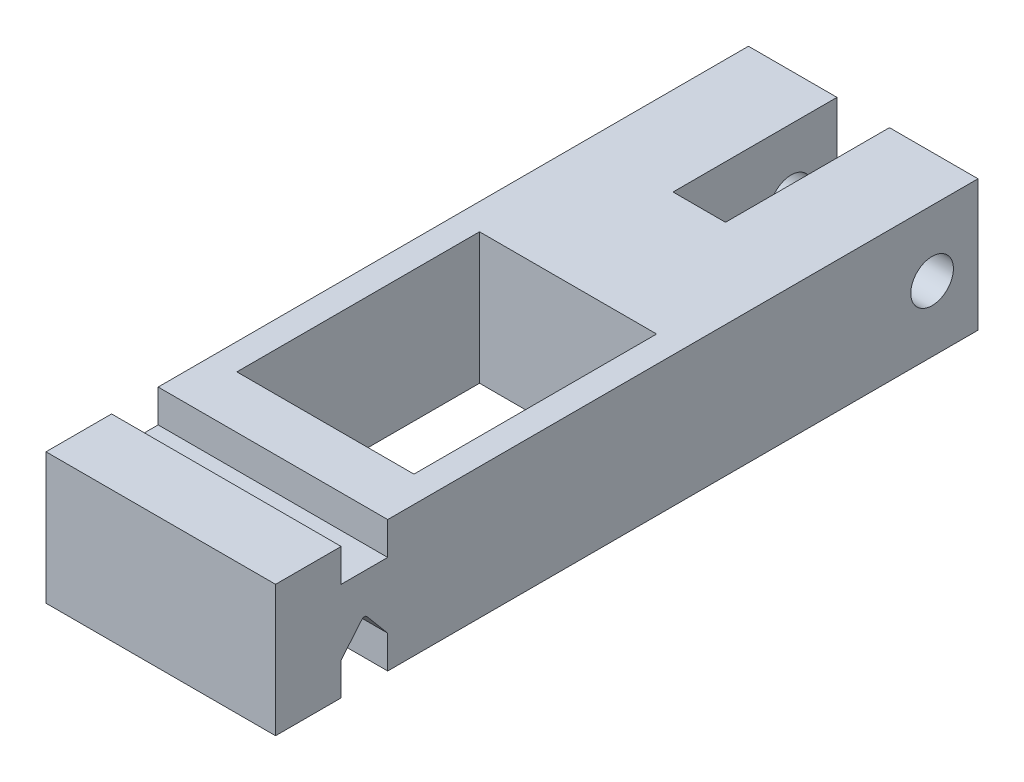
ISO-10303-21;
HEADER;
FILE_DESCRIPTION(('STEP AP214'),'2;1');
FILE_NAME('part.step','',(''),(''),'','','');
FILE_SCHEMA(('AUTOMOTIVE_DESIGN { 1 0 10303 214 1 1 1 1 }'));
ENDSEC;
DATA;
#1=APPLICATION_CONTEXT('core data for automotive mechanical design processes');
#2=APPLICATION_PROTOCOL_DEFINITION('international standard','automotive_design',2000,#1);
#3=PRODUCT_CONTEXT('',#1,'mechanical');
#4=PRODUCT('Part','Part','',(#3));
#5=PRODUCT_RELATED_PRODUCT_CATEGORY('part','',(#4));
#6=PRODUCT_DEFINITION_FORMATION('','',#4);
#7=PRODUCT_DEFINITION_CONTEXT('part definition',#1,'design');
#8=PRODUCT_DEFINITION('design','',#6,#7);
#9=PRODUCT_DEFINITION_SHAPE('','',#8);
#10=(LENGTH_UNIT() NAMED_UNIT(*) SI_UNIT(.MILLI.,.METRE.));
#11=(NAMED_UNIT(*) PLANE_ANGLE_UNIT() SI_UNIT($,.RADIAN.));
#12=(NAMED_UNIT(*) SI_UNIT($,.STERADIAN.) SOLID_ANGLE_UNIT());
#13=UNCERTAINTY_MEASURE_WITH_UNIT(LENGTH_MEASURE(1.E-05),#10,'distance_accuracy_value','');
#14=(GEOMETRIC_REPRESENTATION_CONTEXT(3) GLOBAL_UNCERTAINTY_ASSIGNED_CONTEXT((#13)) GLOBAL_UNIT_ASSIGNED_CONTEXT((#10,
#11,#12)) REPRESENTATION_CONTEXT('',''));
#15=CARTESIAN_POINT('',(0.,0.,0.));
#16=DIRECTION('',(0.,0.,1.));
#17=DIRECTION('',(1.,0.,0.));
#18=AXIS2_PLACEMENT_3D('',#15,#16,#17);
#19=CARTESIAN_POINT('',(35.,10.,-107.1));
#20=DIRECTION('',(0.,0.,1.));
#21=DIRECTION('',(1.,0.,0.));
#22=AXIS2_PLACEMENT_3D('',#19,#20,#21);
#23=PLANE('',#22);
#24=DIRECTION('',(-1.,0.,0.));
#25=VECTOR('',#24,1.);
#26=CARTESIAN_POINT('',(35.,-10.,-107.1));
#27=LINE('',#26,#25);
#28=CARTESIAN_POINT('',(35.,-10.,-107.1));
#29=VERTEX_POINT('',#28);
#30=CARTESIAN_POINT('',(21.5,-10.,-107.1));
#31=VERTEX_POINT('',#30);
#32=EDGE_CURVE('E340',#29,#31,#27,.T.);
#33=ORIENTED_EDGE('',*,*,#32,.T.);
#34=DIRECTION('',(0.,1.,0.));
#35=VECTOR('',#34,1.);
#36=CARTESIAN_POINT('',(21.5,-10.001,-107.1));
#37=LINE('',#36,#35);
#38=CARTESIAN_POINT('',(21.5,10.,-107.1));
#39=VERTEX_POINT('',#38);
#40=EDGE_CURVE('E237',#31,#39,#37,.T.);
#41=ORIENTED_EDGE('',*,*,#40,.T.);
#42=DIRECTION('',(-1.,0.,0.));
#43=VECTOR('',#42,1.);
#44=CARTESIAN_POINT('',(35.,10.,-107.1));
#45=LINE('',#44,#43);
#46=CARTESIAN_POINT('',(35.,10.,-107.1));
#47=VERTEX_POINT('',#46);
#48=EDGE_CURVE('E336',#47,#39,#45,.T.);
#49=ORIENTED_EDGE('',*,*,#48,.F.);
#50=DIRECTION('',(0.,1.,0.));
#51=VECTOR('',#50,1.);
#52=CARTESIAN_POINT('',(35.,10.,-107.1));
#53=LINE('',#52,#51);
#54=EDGE_CURVE('E266',#29,#47,#53,.T.);
#55=ORIENTED_EDGE('',*,*,#54,.F.);
#56=EDGE_LOOP('',(#33,#41,#49,#55));
#57=FACE_BOUND('',#56,.T.);
#58=ADVANCED_FACE('F34',(#57),#23,.F.);
#59=CARTESIAN_POINT('',(35.,0.,-100.1));
#60=DIRECTION('',(-1.,0.,0.));
#61=DIRECTION('',(0.,0.,1.));
#62=AXIS2_PLACEMENT_3D('',#59,#60,#61);
#63=CYLINDRICAL_SURFACE('',#62,3.25000000000001);
#64=CARTESIAN_POINT('',(21.5,0.,-100.1));
#65=DIRECTION('',(1.,0.,0.));
#66=DIRECTION('',(0.,0.,-1.));
#67=AXIS2_PLACEMENT_3D('',#64,#65,#66);
#68=CIRCLE('',#67,3.25000000000001);
#69=CARTESIAN_POINT('',(21.5,0.,-103.35));
#70=VERTEX_POINT('',#69);
#71=EDGE_CURVE('E219',#70,#70,#68,.F.);
#72=ORIENTED_EDGE('',*,*,#71,.T.);
#73=EDGE_LOOP('',(#72));
#74=FACE_BOUND('',#73,.T.);
#75=CARTESIAN_POINT('',(35.,0.,-100.1));
#76=DIRECTION('',(1.,0.,0.));
#77=DIRECTION('',(0.,0.,-1.));
#78=AXIS2_PLACEMENT_3D('',#75,#76,#77);
#79=CIRCLE('',#78,3.25000000000001);
#80=CARTESIAN_POINT('',(35.,0.,-103.35));
#81=VERTEX_POINT('',#80);
#82=EDGE_CURVE('E250',#81,#81,#79,.T.);
#83=ORIENTED_EDGE('',*,*,#82,.T.);
#84=EDGE_LOOP('',(#83));
#85=FACE_BOUND('',#84,.T.);
#86=ADVANCED_FACE('F452',(#74,#85),#63,.F.);
#87=CARTESIAN_POINT('',(35.,0.,0.));
#88=DIRECTION('',(-1.,0.,0.));
#89=DIRECTION('',(0.,0.,1.));
#90=AXIS2_PLACEMENT_3D('',#87,#88,#89);
#91=PLANE('',#90);
#92=DIRECTION('',(0.,0.766044443118979,-0.642787609686538));
#93=VECTOR('',#92,1.);
#94=CARTESIAN_POINT('',(35.,-0.769274746290539,-13.55));
#95=LINE('',#94,#93);
#96=CARTESIAN_POINT('',(35.,-5.,-10.));
#97=VERTEX_POINT('',#96);
#98=CARTESIAN_POINT('',(35.,-1.22574285487748,-13.1669777784405));
#99=VERTEX_POINT('',#98);
#100=EDGE_CURVE('E256',#97,#99,#95,.T.);
#101=ORIENTED_EDGE('',*,*,#100,.T.);
#102=CARTESIAN_POINT('',(35.,-1.54713665972075,-13.55));
#103=DIRECTION('',(-1.,0.,0.));
#104=DIRECTION('',(0.,0.,1.));
#105=AXIS2_PLACEMENT_3D('',#102,#103,#104);
#106=CIRCLE('',#105,0.5);
#107=CARTESIAN_POINT('',(35.,-1.22574285487748,-13.9330222215595));
#108=VERTEX_POINT('',#107);
#109=EDGE_CURVE('E11',#99,#108,#106,.T.);
#110=ORIENTED_EDGE('',*,*,#109,.T.);
#111=DIRECTION('',(0.,-0.766044443118979,-0.642787609686538));
#112=VECTOR('',#111,1.);
#113=CARTESIAN_POINT('',(35.,-5.,-17.1));
#114=LINE('',#113,#112);
#115=CARTESIAN_POINT('',(35.,-5.,-17.1));
#116=VERTEX_POINT('',#115);
#117=EDGE_CURVE('E259',#108,#116,#114,.T.);
#118=ORIENTED_EDGE('',*,*,#117,.T.);
#119=DIRECTION('',(0.,-1.,0.));
#120=VECTOR('',#119,1.);
#121=CARTESIAN_POINT('',(35.,-5.,-17.1));
#122=LINE('',#121,#120);
#123=CARTESIAN_POINT('',(35.,-10.,-17.1));
#124=VERTEX_POINT('',#123);
#125=EDGE_CURVE('E262',#116,#124,#122,.T.);
#126=ORIENTED_EDGE('',*,*,#125,.T.);
#127=DIRECTION('',(0.,0.,-1.));
#128=VECTOR('',#127,1.);
#129=CARTESIAN_POINT('',(35.,-10.,-17.1));
#130=LINE('',#129,#128);
#131=EDGE_CURVE('E264',#124,#29,#130,.T.);
#132=ORIENTED_EDGE('',*,*,#131,.T.);
#133=ORIENTED_EDGE('',*,*,#54,.T.);
#134=DIRECTION('',(0.,0.,1.));
#135=VECTOR('',#134,1.);
#136=CARTESIAN_POINT('',(35.,10.,-17.1));
#137=LINE('',#136,#135);
#138=CARTESIAN_POINT('',(35.,10.,-17.1));
#139=VERTEX_POINT('',#138);
#140=EDGE_CURVE('E268',#47,#139,#137,.T.);
#141=ORIENTED_EDGE('',*,*,#140,.T.);
#142=DIRECTION('',(0.,-1.,0.));
#143=VECTOR('',#142,1.);
#144=CARTESIAN_POINT('',(35.,5.,-17.1));
#145=LINE('',#144,#143);
#146=CARTESIAN_POINT('',(35.,5.,-17.1));
#147=VERTEX_POINT('',#146);
#148=EDGE_CURVE('E270',#139,#147,#145,.T.);
#149=ORIENTED_EDGE('',*,*,#148,.T.);
#150=DIRECTION('',(0.,0.,1.));
#151=VECTOR('',#150,1.);
#152=CARTESIAN_POINT('',(35.,5.,-10.));
#153=LINE('',#152,#151);
#154=CARTESIAN_POINT('',(35.,5.,-10.));
#155=VERTEX_POINT('',#154);
#156=EDGE_CURVE('E272',#147,#155,#153,.T.);
#157=ORIENTED_EDGE('',*,*,#156,.T.);
#158=DIRECTION('',(0.,1.,0.));
#159=VECTOR('',#158,1.);
#160=CARTESIAN_POINT('',(35.,10.,-10.));
#161=LINE('',#160,#159);
#162=CARTESIAN_POINT('',(35.,10.,-10.));
#163=VERTEX_POINT('',#162);
#164=EDGE_CURVE('E274',#155,#163,#161,.T.);
#165=ORIENTED_EDGE('',*,*,#164,.T.);
#166=DIRECTION('',(0.,0.,1.));
#167=VECTOR('',#166,1.);
#168=CARTESIAN_POINT('',(35.,10.,0.));
#169=LINE('',#168,#167);
#170=CARTESIAN_POINT('',(35.,10.,0.));
#171=VERTEX_POINT('',#170);
#172=EDGE_CURVE('E276',#163,#171,#169,.T.);
#173=ORIENTED_EDGE('',*,*,#172,.T.);
#174=DIRECTION('',(0.,-1.,0.));
#175=VECTOR('',#174,1.);
#176=CARTESIAN_POINT('',(35.,10.,0.));
#177=LINE('',#176,#175);
#178=CARTESIAN_POINT('',(35.,-10.,0.));
#179=VERTEX_POINT('',#178);
#180=EDGE_CURVE('E278',#171,#179,#177,.T.);
#181=ORIENTED_EDGE('',*,*,#180,.T.);
#182=DIRECTION('',(0.,0.,-1.));
#183=VECTOR('',#182,1.);
#184=CARTESIAN_POINT('',(35.,-10.,-10.));
#185=LINE('',#184,#183);
#186=CARTESIAN_POINT('',(35.,-10.,-10.));
#187=VERTEX_POINT('',#186);
#188=EDGE_CURVE('E280',#179,#187,#185,.T.);
#189=ORIENTED_EDGE('',*,*,#188,.T.);
#190=DIRECTION('',(0.,1.,0.));
#191=VECTOR('',#190,1.);
#192=CARTESIAN_POINT('',(35.,-10.,-10.));
#193=LINE('',#192,#191);
#194=EDGE_CURVE('E282',#187,#97,#193,.T.);
#195=ORIENTED_EDGE('',*,*,#194,.T.);
#196=EDGE_LOOP('',(#101,#110,#118,#126,#132,#133,#141,#149,#157,#165,#173,#181,#189,#195));
#197=FACE_BOUND('',#196,.T.);
#198=ORIENTED_EDGE('',*,*,#82,.F.);
#199=EDGE_LOOP('',(#198));
#200=FACE_BOUND('',#199,.T.);
#201=ADVANCED_FACE('F370',(#197,#200),#91,.F.);
#202=CARTESIAN_POINT('',(0.,0.,0.));
#203=DIRECTION('',(-1.,0.,0.));
#204=DIRECTION('',(0.,0.,1.));
#205=AXIS2_PLACEMENT_3D('',#202,#203,#204);
#206=PLANE('',#205);
#207=DIRECTION('',(0.,0.766044443118979,-0.642787609686538));
#208=VECTOR('',#207,1.);
#209=CARTESIAN_POINT('',(0.,-0.769274746290539,-13.55));
#210=LINE('',#209,#208);
#211=CARTESIAN_POINT('',(0.,-5.,-10.));
#212=VERTEX_POINT('',#211);
#213=CARTESIAN_POINT('',(0.,-1.22574285487748,-13.1669777784405));
#214=VERTEX_POINT('',#213);
#215=EDGE_CURVE('E253',#212,#214,#210,.T.);
#216=ORIENTED_EDGE('',*,*,#215,.F.);
#217=DIRECTION('',(0.,1.,0.));
#218=VECTOR('',#217,1.);
#219=CARTESIAN_POINT('',(0.,-10.,-10.));
#220=LINE('',#219,#218);
#221=CARTESIAN_POINT('',(0.,-10.,-10.));
#222=VERTEX_POINT('',#221);
#223=EDGE_CURVE('E260',#222,#212,#220,.T.);
#224=ORIENTED_EDGE('',*,*,#223,.F.);
#225=DIRECTION('',(0.,0.,-1.));
#226=VECTOR('',#225,1.);
#227=CARTESIAN_POINT('',(0.,-10.,-10.));
#228=LINE('',#227,#226);
#229=CARTESIAN_POINT('',(0.,-10.,0.));
#230=VERTEX_POINT('',#229);
#231=EDGE_CURVE('E309',#230,#222,#228,.T.);
#232=ORIENTED_EDGE('',*,*,#231,.F.);
#233=DIRECTION('',(0.,-1.,0.));
#234=VECTOR('',#233,1.);
#235=CARTESIAN_POINT('',(0.,10.,0.));
#236=LINE('',#235,#234);
#237=CARTESIAN_POINT('',(0.,10.,0.));
#238=VERTEX_POINT('',#237);
#239=EDGE_CURVE('E307',#238,#230,#236,.T.);
#240=ORIENTED_EDGE('',*,*,#239,.F.);
#241=DIRECTION('',(0.,0.,1.));
#242=VECTOR('',#241,1.);
#243=CARTESIAN_POINT('',(0.,10.,0.));
#244=LINE('',#243,#242);
#245=CARTESIAN_POINT('',(0.,10.,-10.));
#246=VERTEX_POINT('',#245);
#247=EDGE_CURVE('E305',#246,#238,#244,.T.);
#248=ORIENTED_EDGE('',*,*,#247,.F.);
#249=DIRECTION('',(0.,1.,0.));
#250=VECTOR('',#249,1.);
#251=CARTESIAN_POINT('',(0.,10.,-10.));
#252=LINE('',#251,#250);
#253=CARTESIAN_POINT('',(0.,5.,-10.));
#254=VERTEX_POINT('',#253);
#255=EDGE_CURVE('E303',#254,#246,#252,.T.);
#256=ORIENTED_EDGE('',*,*,#255,.F.);
#257=DIRECTION('',(0.,0.,1.));
#258=VECTOR('',#257,1.);
#259=CARTESIAN_POINT('',(0.,5.,-10.));
#260=LINE('',#259,#258);
#261=CARTESIAN_POINT('',(0.,5.,-17.1));
#262=VERTEX_POINT('',#261);
#263=EDGE_CURVE('E301',#262,#254,#260,.T.);
#264=ORIENTED_EDGE('',*,*,#263,.F.);
#265=DIRECTION('',(0.,-1.,0.));
#266=VECTOR('',#265,1.);
#267=CARTESIAN_POINT('',(0.,5.,-17.1));
#268=LINE('',#267,#266);
#269=CARTESIAN_POINT('',(0.,10.,-17.1));
#270=VERTEX_POINT('',#269);
#271=EDGE_CURVE('E299',#270,#262,#268,.T.);
#272=ORIENTED_EDGE('',*,*,#271,.F.);
#273=DIRECTION('',(0.,0.,1.));
#274=VECTOR('',#273,1.);
#275=CARTESIAN_POINT('',(0.,10.,-17.1));
#276=LINE('',#275,#274);
#277=CARTESIAN_POINT('',(0.,10.,-107.1));
#278=VERTEX_POINT('',#277);
#279=EDGE_CURVE('E297',#278,#270,#276,.T.);
#280=ORIENTED_EDGE('',*,*,#279,.F.);
#281=DIRECTION('',(0.,1.,0.));
#282=VECTOR('',#281,1.);
#283=CARTESIAN_POINT('',(0.,10.,-107.1));
#284=LINE('',#283,#282);
#285=CARTESIAN_POINT('',(0.,-10.,-107.1));
#286=VERTEX_POINT('',#285);
#287=EDGE_CURVE('E294',#286,#278,#284,.T.);
#288=ORIENTED_EDGE('',*,*,#287,.F.);
#289=DIRECTION('',(0.,0.,-1.));
#290=VECTOR('',#289,1.);
#291=CARTESIAN_POINT('',(0.,-10.,-17.1));
#292=LINE('',#291,#290);
#293=CARTESIAN_POINT('',(0.,-10.,-17.1));
#294=VERTEX_POINT('',#293);
#295=EDGE_CURVE('E291',#294,#286,#292,.T.);
#296=ORIENTED_EDGE('',*,*,#295,.F.);
#297=DIRECTION('',(0.,-1.,0.));
#298=VECTOR('',#297,1.);
#299=CARTESIAN_POINT('',(0.,-5.,-17.1));
#300=LINE('',#299,#298);
#301=CARTESIAN_POINT('',(0.,-5.,-17.1));
#302=VERTEX_POINT('',#301);
#303=EDGE_CURVE('E289',#302,#294,#300,.T.);
#304=ORIENTED_EDGE('',*,*,#303,.F.);
#305=DIRECTION('',(0.,-0.766044443118979,-0.642787609686538));
#306=VECTOR('',#305,1.);
#307=CARTESIAN_POINT('',(0.,-5.,-17.1));
#308=LINE('',#307,#306);
#309=CARTESIAN_POINT('',(0.,-1.22574285487748,-13.9330222215595));
#310=VERTEX_POINT('',#309);
#311=EDGE_CURVE('E287',#310,#302,#308,.T.);
#312=ORIENTED_EDGE('',*,*,#311,.F.);
#313=CARTESIAN_POINT('',(0.,-1.54713665972075,-13.55));
#314=DIRECTION('',(-1.,0.,0.));
#315=DIRECTION('',(0.,0.,1.));
#316=AXIS2_PLACEMENT_3D('',#313,#314,#315);
#317=CIRCLE('',#316,0.5);
#318=EDGE_CURVE('E42',#310,#214,#317,.F.);
#319=ORIENTED_EDGE('',*,*,#318,.T.);
#320=EDGE_LOOP('',(#216,#224,#232,#240,#248,#256,#264,#272,#280,#288,#296,#304,#312,#319));
#321=FACE_BOUND('',#320,.T.);
#322=CARTESIAN_POINT('',(0.,0.,-100.1));
#323=DIRECTION('',(1.,0.,0.));
#324=DIRECTION('',(0.,0.,-1.));
#325=AXIS2_PLACEMENT_3D('',#322,#323,#324);
#326=CIRCLE('',#325,3.25000000000001);
#327=CARTESIAN_POINT('',(0.,0.,-103.35));
#328=VERTEX_POINT('',#327);
#329=EDGE_CURVE('E249',#328,#328,#326,.T.);
#330=ORIENTED_EDGE('',*,*,#329,.T.);
#331=EDGE_LOOP('',(#330));
#332=FACE_BOUND('',#331,.T.);
#333=ADVANCED_FACE('F356',(#321,#332),#206,.T.);
#334=CARTESIAN_POINT('',(35.,-0.769274746290539,-13.55));
#335=DIRECTION('',(0.,0.642787609686538,0.766044443118979));
#336=DIRECTION('',(0.,-0.766044443118979,0.642787609686538));
#337=AXIS2_PLACEMENT_3D('',#334,#335,#336);
#338=PLANE('',#337);
#339=ORIENTED_EDGE('',*,*,#215,.T.);
#340=DIRECTION('',(-1.,0.,0.));
#341=VECTOR('',#340,1.);
#342=CARTESIAN_POINT('',(35.,-1.22574285487748,-13.1669777784405));
#343=LINE('',#342,#341);
#344=EDGE_CURVE('E352',#214,#99,#343,.F.);
#345=ORIENTED_EDGE('',*,*,#344,.T.);
#346=ORIENTED_EDGE('',*,*,#100,.F.);
#347=DIRECTION('',(-1.,0.,0.));
#348=VECTOR('',#347,1.);
#349=CARTESIAN_POINT('',(35.,-5.,-10.));
#350=LINE('',#349,#348);
#351=EDGE_CURVE('E284',#97,#212,#350,.T.);
#352=ORIENTED_EDGE('',*,*,#351,.T.);
#353=EDGE_LOOP('',(#339,#345,#346,#352));
#354=FACE_BOUND('',#353,.T.);
#355=ADVANCED_FACE('F364',(#354),#338,.F.);
#356=CARTESIAN_POINT('',(35.,-5.,-17.1));
#357=DIRECTION('',(0.,0.642787609686538,-0.766044443118979));
#358=DIRECTION('',(0.,0.766044443118979,0.642787609686538));
#359=AXIS2_PLACEMENT_3D('',#356,#357,#358);
#360=PLANE('',#359);
#361=ORIENTED_EDGE('',*,*,#117,.F.);
#362=DIRECTION('',(-1.,0.,0.));
#363=VECTOR('',#362,1.);
#364=CARTESIAN_POINT('',(0.,-1.22574285487748,-13.9330222215595));
#365=LINE('',#364,#363);
#366=EDGE_CURVE('E349',#108,#310,#365,.T.);
#367=ORIENTED_EDGE('',*,*,#366,.T.);
#368=ORIENTED_EDGE('',*,*,#311,.T.);
#369=DIRECTION('',(-1.,0.,0.));
#370=VECTOR('',#369,1.);
#371=CARTESIAN_POINT('',(35.,-5.,-17.1));
#372=LINE('',#371,#370);
#373=EDGE_CURVE('E346',#116,#302,#372,.T.);
#374=ORIENTED_EDGE('',*,*,#373,.F.);
#375=EDGE_LOOP('',(#361,#367,#368,#374));
#376=FACE_BOUND('',#375,.T.);
#377=ADVANCED_FACE('F374',(#376),#360,.F.);
#378=CARTESIAN_POINT('',(35.,-5.,-17.1));
#379=DIRECTION('',(0.,0.,-1.));
#380=DIRECTION('',(-1.,0.,0.));
#381=AXIS2_PLACEMENT_3D('',#378,#379,#380);
#382=PLANE('',#381);
#383=ORIENTED_EDGE('',*,*,#303,.T.);
#384=DIRECTION('',(-1.,0.,0.));
#385=VECTOR('',#384,1.);
#386=CARTESIAN_POINT('',(35.,-10.,-17.1));
#387=LINE('',#386,#385);
#388=EDGE_CURVE('E343',#124,#294,#387,.T.);
#389=ORIENTED_EDGE('',*,*,#388,.F.);
#390=ORIENTED_EDGE('',*,*,#125,.F.);
#391=ORIENTED_EDGE('',*,*,#373,.T.);
#392=EDGE_LOOP('',(#383,#389,#390,#391));
#393=FACE_BOUND('',#392,.T.);
#394=ADVANCED_FACE('F378',(#393),#382,.F.);
#395=CARTESIAN_POINT('',(35.,-10.,-17.1));
#396=DIRECTION('',(0.,1.,0.));
#397=DIRECTION('',(0.,0.,1.));
#398=AXIS2_PLACEMENT_3D('',#395,#396,#397);
#399=PLANE('',#398);
#400=DIRECTION('',(1.,0.,0.));
#401=VECTOR('',#400,1.);
#402=CARTESIAN_POINT('',(4.,-10.,-25.1));
#403=LINE('',#402,#401);
#404=CARTESIAN_POINT('',(4.,-10.,-25.1));
#405=VERTEX_POINT('',#404);
#406=CARTESIAN_POINT('',(31.,-10.,-25.1));
#407=VERTEX_POINT('',#406);
#408=EDGE_CURVE('E190',#405,#407,#403,.T.);
#409=ORIENTED_EDGE('',*,*,#408,.T.);
#410=DIRECTION('',(0.,0.,-1.));
#411=VECTOR('',#410,1.);
#412=CARTESIAN_POINT('',(31.,-10.,-25.1));
#413=LINE('',#412,#411);
#414=CARTESIAN_POINT('',(31.,-10.,-62.1));
#415=VERTEX_POINT('',#414);
#416=EDGE_CURVE('E184',#407,#415,#413,.T.);
#417=ORIENTED_EDGE('',*,*,#416,.T.);
#418=DIRECTION('',(-1.,0.,0.));
#419=VECTOR('',#418,1.);
#420=CARTESIAN_POINT('',(4.,-10.,-62.1));
#421=LINE('',#420,#419);
#422=CARTESIAN_POINT('',(4.00000000000001,-10.,-62.1));
#423=VERTEX_POINT('',#422);
#424=EDGE_CURVE('E193',#415,#423,#421,.T.);
#425=ORIENTED_EDGE('',*,*,#424,.T.);
#426=DIRECTION('',(0.,0.,1.));
#427=VECTOR('',#426,1.);
#428=CARTESIAN_POINT('',(4.,-10.,-25.1));
#429=LINE('',#428,#427);
#430=EDGE_CURVE('E49',#423,#405,#429,.T.);
#431=ORIENTED_EDGE('',*,*,#430,.T.);
#432=EDGE_LOOP('',(#409,#417,#425,#431));
#433=FACE_BOUND('',#432,.T.);
#434=DIRECTION('',(-1.,0.,0.));
#435=VECTOR('',#434,1.);
#436=CARTESIAN_POINT('',(21.5,-10.,-82.1));
#437=LINE('',#436,#435);
#438=CARTESIAN_POINT('',(21.5,-10.,-82.1));
#439=VERTEX_POINT('',#438);
#440=CARTESIAN_POINT('',(13.5,-10.,-82.1));
#441=VERTEX_POINT('',#440);
#442=EDGE_CURVE('E222',#439,#441,#437,.T.);
#443=ORIENTED_EDGE('',*,*,#442,.F.);
#444=DIRECTION('',(0.,0.,1.));
#445=VECTOR('',#444,1.);
#446=CARTESIAN_POINT('',(21.5,-10.,-107.1));
#447=LINE('',#446,#445);
#448=EDGE_CURVE('E225',#31,#439,#447,.T.);
#449=ORIENTED_EDGE('',*,*,#448,.F.);
#450=ORIENTED_EDGE('',*,*,#32,.F.);
#451=ORIENTED_EDGE('',*,*,#131,.F.);
#452=ORIENTED_EDGE('',*,*,#388,.T.);
#453=ORIENTED_EDGE('',*,*,#295,.T.);
#454=CARTESIAN_POINT('',(13.5,-10.,-107.1));
#455=VERTEX_POINT('',#454);
#456=EDGE_CURVE('E339',#455,#286,#27,.T.);
#457=ORIENTED_EDGE('',*,*,#456,.F.);
#458=DIRECTION('',(0.,0.,-1.));
#459=VECTOR('',#458,1.);
#460=CARTESIAN_POINT('',(13.5,-10.,-82.1));
#461=LINE('',#460,#459);
#462=EDGE_CURVE('E240',#441,#455,#461,.T.);
#463=ORIENTED_EDGE('',*,*,#462,.F.);
#464=EDGE_LOOP('',(#443,#449,#450,#451,#452,#453,#457,#463));
#465=FACE_BOUND('',#464,.T.);
#466=ADVANCED_FACE('F197',(#433,#465),#399,.F.);
#467=CARTESIAN_POINT('',(13.5,10.,-107.1));
#468=VERTEX_POINT('',#467);
#469=EDGE_CURVE('E335',#468,#278,#45,.T.);
#470=ORIENTED_EDGE('',*,*,#469,.F.);
#471=DIRECTION('',(0.,1.,0.));
#472=VECTOR('',#471,1.);
#473=CARTESIAN_POINT('',(13.5,-10.001,-107.1));
#474=LINE('',#473,#472);
#475=EDGE_CURVE('E236',#455,#468,#474,.T.);
#476=ORIENTED_EDGE('',*,*,#475,.F.);
#477=ORIENTED_EDGE('',*,*,#456,.T.);
#478=ORIENTED_EDGE('',*,*,#287,.T.);
#479=EDGE_LOOP('',(#470,#476,#477,#478));
#480=FACE_BOUND('',#479,.T.);
#481=ADVANCED_FACE('F432',(#480),#23,.F.);
#482=CARTESIAN_POINT('',(35.,10.,-17.1));
#483=DIRECTION('',(0.,-1.,0.));
#484=DIRECTION('',(0.,0.,-1.));
#485=AXIS2_PLACEMENT_3D('',#482,#483,#484);
#486=PLANE('',#485);
#487=DIRECTION('',(-1.,0.,0.));
#488=VECTOR('',#487,1.);
#489=CARTESIAN_POINT('',(4.,10.,-62.1));
#490=LINE('',#489,#488);
#491=CARTESIAN_POINT('',(31.,10.,-62.1));
#492=VERTEX_POINT('',#491);
#493=CARTESIAN_POINT('',(4.,10.,-62.1));
#494=VERTEX_POINT('',#493);
#495=EDGE_CURVE('E209',#492,#494,#490,.T.);
#496=ORIENTED_EDGE('',*,*,#495,.F.);
#497=DIRECTION('',(0.,0.,-1.));
#498=VECTOR('',#497,1.);
#499=CARTESIAN_POINT('',(31.,10.,-25.1));
#500=LINE('',#499,#498);
#501=CARTESIAN_POINT('',(31.,10.,-25.1));
#502=VERTEX_POINT('',#501);
#503=EDGE_CURVE('E57',#502,#492,#500,.T.);
#504=ORIENTED_EDGE('',*,*,#503,.F.);
#505=DIRECTION('',(1.,0.,0.));
#506=VECTOR('',#505,1.);
#507=CARTESIAN_POINT('',(4.,10.,-25.1));
#508=LINE('',#507,#506);
#509=CARTESIAN_POINT('',(4.,10.,-25.1));
#510=VERTEX_POINT('',#509);
#511=EDGE_CURVE('E200',#510,#502,#508,.T.);
#512=ORIENTED_EDGE('',*,*,#511,.F.);
#513=DIRECTION('',(0.,0.,1.));
#514=VECTOR('',#513,1.);
#515=CARTESIAN_POINT('',(4.,10.,-25.1));
#516=LINE('',#515,#514);
#517=EDGE_CURVE('E203',#494,#510,#516,.T.);
#518=ORIENTED_EDGE('',*,*,#517,.F.);
#519=EDGE_LOOP('',(#496,#504,#512,#518));
#520=FACE_BOUND('',#519,.T.);
#521=ORIENTED_EDGE('',*,*,#48,.T.);
#522=DIRECTION('',(0.,0.,-1.));
#523=VECTOR('',#522,1.);
#524=CARTESIAN_POINT('',(21.5,10.,-107.1));
#525=LINE('',#524,#523);
#526=CARTESIAN_POINT('',(21.5,10.,-82.1));
#527=VERTEX_POINT('',#526);
#528=EDGE_CURVE('E234',#527,#39,#525,.T.);
#529=ORIENTED_EDGE('',*,*,#528,.F.);
#530=DIRECTION('',(1.,0.,0.));
#531=VECTOR('',#530,1.);
#532=CARTESIAN_POINT('',(21.5,10.,-82.1));
#533=LINE('',#532,#531);
#534=CARTESIAN_POINT('',(13.5,10.,-82.1));
#535=VERTEX_POINT('',#534);
#536=EDGE_CURVE('E231',#535,#527,#533,.T.);
#537=ORIENTED_EDGE('',*,*,#536,.F.);
#538=DIRECTION('',(0.,0.,1.));
#539=VECTOR('',#538,1.);
#540=CARTESIAN_POINT('',(13.5,10.,-82.1));
#541=LINE('',#540,#539);
#542=EDGE_CURVE('E228',#468,#535,#541,.T.);
#543=ORIENTED_EDGE('',*,*,#542,.F.);
#544=ORIENTED_EDGE('',*,*,#469,.T.);
#545=ORIENTED_EDGE('',*,*,#279,.T.);
#546=DIRECTION('',(-1.,0.,0.));
#547=VECTOR('',#546,1.);
#548=CARTESIAN_POINT('',(35.,10.,-17.1));
#549=LINE('',#548,#547);
#550=EDGE_CURVE('E332',#139,#270,#549,.T.);
#551=ORIENTED_EDGE('',*,*,#550,.F.);
#552=ORIENTED_EDGE('',*,*,#140,.F.);
#553=EDGE_LOOP('',(#521,#529,#537,#543,#544,#545,#551,#552));
#554=FACE_BOUND('',#553,.T.);
#555=ADVANCED_FACE('F390',(#520,#554),#486,.F.);
#556=CARTESIAN_POINT('',(35.,5.,-17.1));
#557=DIRECTION('',(0.,0.,-1.));
#558=DIRECTION('',(-1.,0.,0.));
#559=AXIS2_PLACEMENT_3D('',#556,#557,#558);
#560=PLANE('',#559);
#561=ORIENTED_EDGE('',*,*,#271,.T.);
#562=DIRECTION('',(-1.,0.,0.));
#563=VECTOR('',#562,1.);
#564=CARTESIAN_POINT('',(35.,5.,-17.1));
#565=LINE('',#564,#563);
#566=EDGE_CURVE('E329',#147,#262,#565,.T.);
#567=ORIENTED_EDGE('',*,*,#566,.F.);
#568=ORIENTED_EDGE('',*,*,#148,.F.);
#569=ORIENTED_EDGE('',*,*,#550,.T.);
#570=EDGE_LOOP('',(#561,#567,#568,#569));
#571=FACE_BOUND('',#570,.T.);
#572=ADVANCED_FACE('F396',(#571),#560,.F.);
#573=CARTESIAN_POINT('',(35.,5.,-10.));
#574=DIRECTION('',(0.,-1.,0.));
#575=DIRECTION('',(0.,0.,-1.));
#576=AXIS2_PLACEMENT_3D('',#573,#574,#575);
#577=PLANE('',#576);
#578=ORIENTED_EDGE('',*,*,#263,.T.);
#579=DIRECTION('',(-1.,0.,0.));
#580=VECTOR('',#579,1.);
#581=CARTESIAN_POINT('',(35.,5.,-10.));
#582=LINE('',#581,#580);
#583=EDGE_CURVE('E326',#155,#254,#582,.T.);
#584=ORIENTED_EDGE('',*,*,#583,.F.);
#585=ORIENTED_EDGE('',*,*,#156,.F.);
#586=ORIENTED_EDGE('',*,*,#566,.T.);
#587=EDGE_LOOP('',(#578,#584,#585,#586));
#588=FACE_BOUND('',#587,.T.);
#589=ADVANCED_FACE('F400',(#588),#577,.F.);
#590=CARTESIAN_POINT('',(35.,10.,-10.));
#591=DIRECTION('',(0.,0.,1.));
#592=DIRECTION('',(1.,0.,0.));
#593=AXIS2_PLACEMENT_3D('',#590,#591,#592);
#594=PLANE('',#593);
#595=ORIENTED_EDGE('',*,*,#255,.T.);
#596=DIRECTION('',(-1.,0.,0.));
#597=VECTOR('',#596,1.);
#598=CARTESIAN_POINT('',(35.,10.,-10.));
#599=LINE('',#598,#597);
#600=EDGE_CURVE('E323',#163,#246,#599,.T.);
#601=ORIENTED_EDGE('',*,*,#600,.F.);
#602=ORIENTED_EDGE('',*,*,#164,.F.);
#603=ORIENTED_EDGE('',*,*,#583,.T.);
#604=EDGE_LOOP('',(#595,#601,#602,#603));
#605=FACE_BOUND('',#604,.T.);
#606=ADVANCED_FACE('F405',(#605),#594,.F.);
#607=CARTESIAN_POINT('',(35.,10.,0.));
#608=DIRECTION('',(0.,-1.,0.));
#609=DIRECTION('',(0.,0.,-1.));
#610=AXIS2_PLACEMENT_3D('',#607,#608,#609);
#611=PLANE('',#610);
#612=ORIENTED_EDGE('',*,*,#247,.T.);
#613=DIRECTION('',(-1.,0.,0.));
#614=VECTOR('',#613,1.);
#615=CARTESIAN_POINT('',(35.,10.,0.));
#616=LINE('',#615,#614);
#617=EDGE_CURVE('E320',#171,#238,#616,.T.);
#618=ORIENTED_EDGE('',*,*,#617,.F.);
#619=ORIENTED_EDGE('',*,*,#172,.F.);
#620=ORIENTED_EDGE('',*,*,#600,.T.);
#621=EDGE_LOOP('',(#612,#618,#619,#620));
#622=FACE_BOUND('',#621,.T.);
#623=ADVANCED_FACE('F411',(#622),#611,.F.);
#624=CARTESIAN_POINT('',(35.,10.,0.));
#625=DIRECTION('',(0.,0.,-1.));
#626=DIRECTION('',(-1.,0.,0.));
#627=AXIS2_PLACEMENT_3D('',#624,#625,#626);
#628=PLANE('',#627);
#629=ORIENTED_EDGE('',*,*,#239,.T.);
#630=DIRECTION('',(-1.,0.,0.));
#631=VECTOR('',#630,1.);
#632=CARTESIAN_POINT('',(35.,-10.,0.));
#633=LINE('',#632,#631);
#634=EDGE_CURVE('E317',#179,#230,#633,.T.);
#635=ORIENTED_EDGE('',*,*,#634,.F.);
#636=ORIENTED_EDGE('',*,*,#180,.F.);
#637=ORIENTED_EDGE('',*,*,#617,.T.);
#638=EDGE_LOOP('',(#629,#635,#636,#637));
#639=FACE_BOUND('',#638,.T.);
#640=ADVANCED_FACE('F415',(#639),#628,.F.);
#641=CARTESIAN_POINT('',(35.,-10.,-10.));
#642=DIRECTION('',(0.,1.,0.));
#643=DIRECTION('',(0.,0.,1.));
#644=AXIS2_PLACEMENT_3D('',#641,#642,#643);
#645=PLANE('',#644);
#646=ORIENTED_EDGE('',*,*,#231,.T.);
#647=DIRECTION('',(-1.,0.,0.));
#648=VECTOR('',#647,1.);
#649=CARTESIAN_POINT('',(35.,-10.,-10.));
#650=LINE('',#649,#648);
#651=EDGE_CURVE('E314',#187,#222,#650,.T.);
#652=ORIENTED_EDGE('',*,*,#651,.F.);
#653=ORIENTED_EDGE('',*,*,#188,.F.);
#654=ORIENTED_EDGE('',*,*,#634,.T.);
#655=EDGE_LOOP('',(#646,#652,#653,#654));
#656=FACE_BOUND('',#655,.T.);
#657=ADVANCED_FACE('F420',(#656),#645,.F.);
#658=CARTESIAN_POINT('',(35.,-10.,-10.));
#659=DIRECTION('',(0.,0.,1.));
#660=DIRECTION('',(1.,0.,0.));
#661=AXIS2_PLACEMENT_3D('',#658,#659,#660);
#662=PLANE('',#661);
#663=ORIENTED_EDGE('',*,*,#223,.T.);
#664=ORIENTED_EDGE('',*,*,#351,.F.);
#665=ORIENTED_EDGE('',*,*,#194,.F.);
#666=ORIENTED_EDGE('',*,*,#651,.T.);
#667=EDGE_LOOP('',(#663,#664,#665,#666));
#668=FACE_BOUND('',#667,.T.);
#669=ADVANCED_FACE('F423',(#668),#662,.F.);
#670=CARTESIAN_POINT('',(13.5,0.,-100.1));
#671=DIRECTION('',(-1.,0.,0.));
#672=DIRECTION('',(0.,0.,1.));
#673=AXIS2_PLACEMENT_3D('',#670,#671,#672);
#674=CIRCLE('',#673,3.25000000000001);
#675=CARTESIAN_POINT('',(13.5,0.,-96.85));
#676=VERTEX_POINT('',#675);
#677=EDGE_CURVE('E215',#676,#676,#674,.F.);
#678=ORIENTED_EDGE('',*,*,#677,.T.);
#679=EDGE_LOOP('',(#678));
#680=FACE_BOUND('',#679,.T.);
#681=ORIENTED_EDGE('',*,*,#329,.F.);
#682=EDGE_LOOP('',(#681));
#683=FACE_BOUND('',#682,.T.);
#684=ADVANCED_FACE('F442',(#680,#683),#63,.F.);
#685=CARTESIAN_POINT('',(21.5,-10.001,-107.1));
#686=DIRECTION('',(1.,0.,0.));
#687=DIRECTION('',(0.,0.,-1.));
#688=AXIS2_PLACEMENT_3D('',#685,#686,#687);
#689=PLANE('',#688);
#690=ORIENTED_EDGE('',*,*,#71,.F.);
#691=EDGE_LOOP('',(#690));
#692=FACE_BOUND('',#691,.T.);
#693=ORIENTED_EDGE('',*,*,#448,.T.);
#694=DIRECTION('',(0.,1.,0.));
#695=VECTOR('',#694,1.);
#696=CARTESIAN_POINT('',(21.5,-10.001,-82.1));
#697=LINE('',#696,#695);
#698=EDGE_CURVE('E241',#439,#527,#697,.T.);
#699=ORIENTED_EDGE('',*,*,#698,.T.);
#700=ORIENTED_EDGE('',*,*,#528,.T.);
#701=ORIENTED_EDGE('',*,*,#40,.F.);
#702=EDGE_LOOP('',(#693,#699,#700,#701));
#703=FACE_BOUND('',#702,.T.);
#704=ADVANCED_FACE('F440',(#692,#703),#689,.F.);
#705=CARTESIAN_POINT('',(21.5,-10.001,-82.1));
#706=DIRECTION('',(0.,0.,1.));
#707=DIRECTION('',(0.,-1.,0.));
#708=AXIS2_PLACEMENT_3D('',#705,#706,#707);
#709=PLANE('',#708);
#710=ORIENTED_EDGE('',*,*,#442,.T.);
#711=DIRECTION('',(0.,1.,0.));
#712=VECTOR('',#711,1.);
#713=CARTESIAN_POINT('',(13.5,-10.001,-82.1));
#714=LINE('',#713,#712);
#715=EDGE_CURVE('E243',#441,#535,#714,.T.);
#716=ORIENTED_EDGE('',*,*,#715,.T.);
#717=ORIENTED_EDGE('',*,*,#536,.T.);
#718=ORIENTED_EDGE('',*,*,#698,.F.);
#719=EDGE_LOOP('',(#710,#716,#717,#718));
#720=FACE_BOUND('',#719,.T.);
#721=ADVANCED_FACE('F438',(#720),#709,.F.);
#722=CARTESIAN_POINT('',(13.5,-10.001,-82.1));
#723=DIRECTION('',(-1.,0.,0.));
#724=DIRECTION('',(0.,0.,1.));
#725=AXIS2_PLACEMENT_3D('',#722,#723,#724);
#726=PLANE('',#725);
#727=ORIENTED_EDGE('',*,*,#677,.F.);
#728=EDGE_LOOP('',(#727));
#729=FACE_BOUND('',#728,.T.);
#730=ORIENTED_EDGE('',*,*,#462,.T.);
#731=ORIENTED_EDGE('',*,*,#475,.T.);
#732=ORIENTED_EDGE('',*,*,#542,.T.);
#733=ORIENTED_EDGE('',*,*,#715,.F.);
#734=EDGE_LOOP('',(#730,#731,#732,#733));
#735=FACE_BOUND('',#734,.T.);
#736=ADVANCED_FACE('F436',(#729,#735),#726,.F.);
#737=CARTESIAN_POINT('',(35.,-1.54713665972075,-13.55));
#738=DIRECTION('',(1.,0.,0.));
#739=DIRECTION('',(0.,0.,-1.));
#740=AXIS2_PLACEMENT_3D('',#737,#738,#739);
#741=CYLINDRICAL_SURFACE('',#740,0.5);
#742=ORIENTED_EDGE('',*,*,#109,.F.);
#743=ORIENTED_EDGE('',*,*,#344,.F.);
#744=ORIENTED_EDGE('',*,*,#318,.F.);
#745=ORIENTED_EDGE('',*,*,#366,.F.);
#746=EDGE_LOOP('',(#742,#743,#744,#745));
#747=FACE_BOUND('',#746,.T.);
#748=ADVANCED_FACE('F36',(#747),#741,.F.);
#749=CARTESIAN_POINT('',(31.,-10.,-25.1));
#750=DIRECTION('',(1.,0.,0.));
#751=DIRECTION('',(0.,0.,-1.));
#752=AXIS2_PLACEMENT_3D('',#749,#750,#751);
#753=PLANE('',#752);
#754=ORIENTED_EDGE('',*,*,#503,.T.);
#755=DIRECTION('',(0.,1.,0.));
#756=VECTOR('',#755,1.);
#757=CARTESIAN_POINT('',(31.,-10.,-62.1));
#758=LINE('',#757,#756);
#759=EDGE_CURVE('E180',#415,#492,#758,.T.);
#760=ORIENTED_EDGE('',*,*,#759,.F.);
#761=ORIENTED_EDGE('',*,*,#416,.F.);
#762=DIRECTION('',(0.,1.,0.));
#763=VECTOR('',#762,1.);
#764=CARTESIAN_POINT('',(31.,-10.,-25.1));
#765=LINE('',#764,#763);
#766=EDGE_CURVE('E213',#407,#502,#765,.T.);
#767=ORIENTED_EDGE('',*,*,#766,.T.);
#768=EDGE_LOOP('',(#754,#760,#761,#767));
#769=FACE_BOUND('',#768,.T.);
#770=ADVANCED_FACE('F182',(#769),#753,.F.);
#771=CARTESIAN_POINT('',(4.,-10.,-25.1));
#772=DIRECTION('',(0.,0.,1.));
#773=DIRECTION('',(0.,-1.,0.));
#774=AXIS2_PLACEMENT_3D('',#771,#772,#773);
#775=PLANE('',#774);
#776=ORIENTED_EDGE('',*,*,#511,.T.);
#777=ORIENTED_EDGE('',*,*,#766,.F.);
#778=ORIENTED_EDGE('',*,*,#408,.F.);
#779=DIRECTION('',(0.,1.,0.));
#780=VECTOR('',#779,1.);
#781=CARTESIAN_POINT('',(4.,-10.,-25.1));
#782=LINE('',#781,#780);
#783=EDGE_CURVE('E216',#405,#510,#782,.T.);
#784=ORIENTED_EDGE('',*,*,#783,.T.);
#785=EDGE_LOOP('',(#776,#777,#778,#784));
#786=FACE_BOUND('',#785,.T.);
#787=ADVANCED_FACE('F600',(#786),#775,.F.);
#788=CARTESIAN_POINT('',(4.,-10.,-25.1));
#789=DIRECTION('',(-1.,0.,0.));
#790=DIRECTION('',(0.,0.,1.));
#791=AXIS2_PLACEMENT_3D('',#788,#789,#790);
#792=PLANE('',#791);
#793=ORIENTED_EDGE('',*,*,#517,.T.);
#794=ORIENTED_EDGE('',*,*,#783,.F.);
#795=ORIENTED_EDGE('',*,*,#430,.F.);
#796=DIRECTION('',(0.,1.,0.));
#797=VECTOR('',#796,1.);
#798=CARTESIAN_POINT('',(4.,-10.,-62.1));
#799=LINE('',#798,#797);
#800=EDGE_CURVE('E189',#423,#494,#799,.T.);
#801=ORIENTED_EDGE('',*,*,#800,.T.);
#802=EDGE_LOOP('',(#793,#794,#795,#801));
#803=FACE_BOUND('',#802,.T.);
#804=ADVANCED_FACE('F608',(#803),#792,.F.);
#805=CARTESIAN_POINT('',(4.,-10.,-62.1));
#806=DIRECTION('',(0.,0.,-1.));
#807=DIRECTION('',(-1.,0.,0.));
#808=AXIS2_PLACEMENT_3D('',#805,#806,#807);
#809=PLANE('',#808);
#810=ORIENTED_EDGE('',*,*,#495,.T.);
#811=ORIENTED_EDGE('',*,*,#800,.F.);
#812=ORIENTED_EDGE('',*,*,#424,.F.);
#813=ORIENTED_EDGE('',*,*,#759,.T.);
#814=EDGE_LOOP('',(#810,#811,#812,#813));
#815=FACE_BOUND('',#814,.T.);
#816=ADVANCED_FACE('F194',(#815),#809,.F.);
#817=CLOSED_SHELL('',(#58,#86,#201,#333,#355,#377,#394,#466,#481,#555,#572,#589,#606,#623,#640,
#657,#669,#684,#704,#721,#736,#748,#770,#787,#804,#816));
#818=MANIFOLD_SOLID_BREP('B2',#817);
#819=ADVANCED_BREP_SHAPE_REPRESENTATION('',(#18,#818),#14);
#820=SHAPE_DEFINITION_REPRESENTATION(#9,#819);
ENDSEC;
END-ISO-10303-21;
